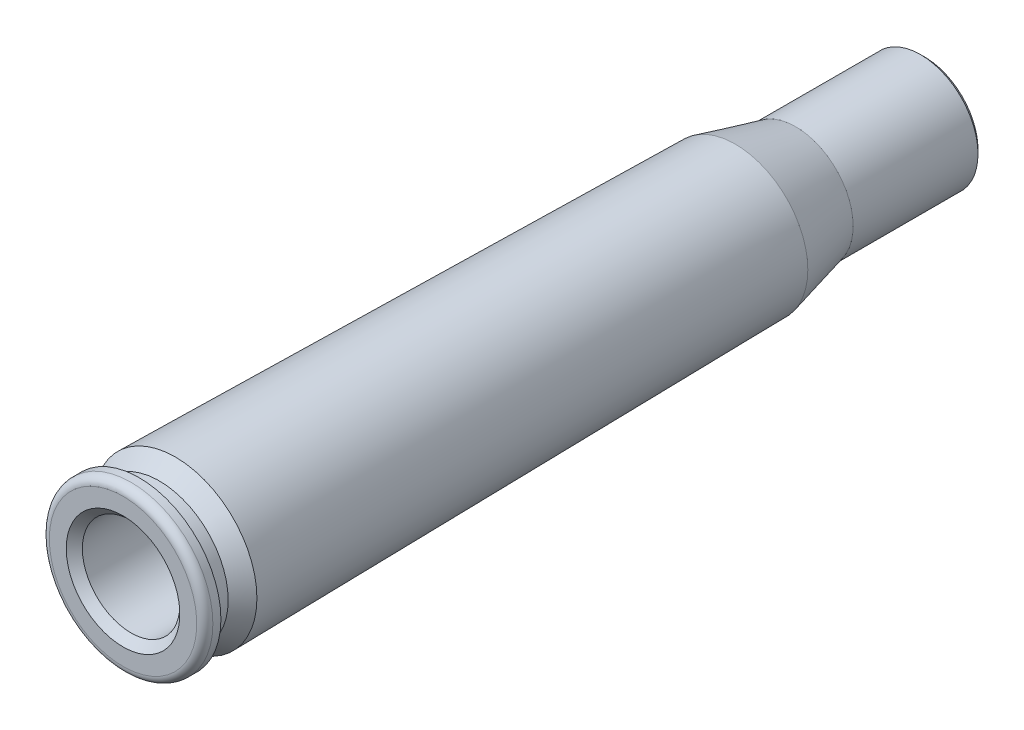
ISO-10303-21;
HEADER;
FILE_DESCRIPTION(('STEP AP214'),'2;1');
FILE_NAME('part.step','',(''),(''),'','','');
FILE_SCHEMA(('AUTOMOTIVE_DESIGN { 1 0 10303 214 1 1 1 1 }'));
ENDSEC;
DATA;
#1=APPLICATION_CONTEXT('core data for automotive mechanical design processes');
#2=APPLICATION_PROTOCOL_DEFINITION('international standard','automotive_design',2000,#1);
#3=PRODUCT_CONTEXT('',#1,'mechanical');
#4=PRODUCT('Part','Part','',(#3));
#5=PRODUCT_RELATED_PRODUCT_CATEGORY('part','',(#4));
#6=PRODUCT_DEFINITION_FORMATION('','',#4);
#7=PRODUCT_DEFINITION_CONTEXT('part definition',#1,'design');
#8=PRODUCT_DEFINITION('design','',#6,#7);
#9=PRODUCT_DEFINITION_SHAPE('','',#8);
#10=(LENGTH_UNIT() NAMED_UNIT(*) SI_UNIT(.MILLI.,.METRE.));
#11=(NAMED_UNIT(*) PLANE_ANGLE_UNIT() SI_UNIT($,.RADIAN.));
#12=(NAMED_UNIT(*) SI_UNIT($,.STERADIAN.) SOLID_ANGLE_UNIT());
#13=UNCERTAINTY_MEASURE_WITH_UNIT(LENGTH_MEASURE(1.E-05),#10,'distance_accuracy_value','');
#14=(GEOMETRIC_REPRESENTATION_CONTEXT(3) GLOBAL_UNCERTAINTY_ASSIGNED_CONTEXT((#13)) GLOBAL_UNIT_ASSIGNED_CONTEXT((#10,
#11,#12)) REPRESENTATION_CONTEXT('',''));
#15=CARTESIAN_POINT('',(0.,0.,0.));
#16=DIRECTION('',(0.,0.,1.));
#17=DIRECTION('',(1.,0.,0.));
#18=AXIS2_PLACEMENT_3D('',#15,#16,#17);
#19=CARTESIAN_POINT('',(0.,0.,0.));
#20=DIRECTION('',(0.,0.,1.));
#21=DIRECTION('',(1.,0.,0.));
#22=AXIS2_PLACEMENT_3D('',#19,#20,#21);
#23=CYLINDRICAL_SURFACE('',#22,6.05000000000001);
#24=CARTESIAN_POINT('',(0.,0.,-1.00000000000002));
#25=DIRECTION('',(0.,0.,-1.));
#26=DIRECTION('',(-1.,0.,0.));
#27=AXIS2_PLACEMENT_3D('',#24,#25,#26);
#28=CIRCLE('',#27,6.05000000000001);
#29=CARTESIAN_POINT('',(-6.05000000000001,0.,-1.00000000000002));
#30=VERTEX_POINT('',#29);
#31=EDGE_CURVE('E39',#30,#30,#28,.F.);
#32=ORIENTED_EDGE('',*,*,#31,.T.);
#33=EDGE_LOOP('',(#32));
#34=FACE_BOUND('',#33,.T.);
#35=CARTESIAN_POINT('',(0.,0.,-99.5));
#36=DIRECTION('',(0.,0.,1.));
#37=DIRECTION('',(1.,0.,0.));
#38=AXIS2_PLACEMENT_3D('',#35,#36,#37);
#39=CIRCLE('',#38,6.05);
#40=CARTESIAN_POINT('',(6.05,0.,-99.5));
#41=VERTEX_POINT('',#40);
#42=EDGE_CURVE('E76',#41,#41,#39,.T.);
#43=ORIENTED_EDGE('',*,*,#42,.F.);
#44=EDGE_LOOP('',(#43));
#45=FACE_BOUND('',#44,.T.);
#46=ADVANCED_FACE('F32',(#34,#45),#23,.F.);
#47=CARTESIAN_POINT('',(0.,0.,0.));
#48=DIRECTION('',(0.,0.,-1.));
#49=DIRECTION('',(-1.,0.,0.));
#50=AXIS2_PLACEMENT_3D('',#47,#48,#49);
#51=PLANE('',#50);
#52=CARTESIAN_POINT('',(0.,0.,0.));
#53=DIRECTION('',(0.,0.,-1.));
#54=DIRECTION('',(-1.,0.,0.));
#55=AXIS2_PLACEMENT_3D('',#52,#53,#54);
#56=CIRCLE('',#55,7.05000000000003);
#57=CARTESIAN_POINT('',(-7.05000000000003,0.,0.));
#58=VERTEX_POINT('',#57);
#59=EDGE_CURVE('E10',#58,#58,#56,.T.);
#60=ORIENTED_EDGE('',*,*,#59,.T.);
#61=EDGE_LOOP('',(#60));
#62=FACE_BOUND('',#61,.T.);
#63=CARTESIAN_POINT('',(0.,0.,0.));
#64=DIRECTION('',(0.,0.,-1.));
#65=DIRECTION('',(-1.,0.,0.));
#66=AXIS2_PLACEMENT_3D('',#63,#64,#65);
#67=CIRCLE('',#66,9.15);
#68=CARTESIAN_POINT('',(-9.15,0.,0.));
#69=VERTEX_POINT('',#68);
#70=EDGE_CURVE('E55',#69,#69,#67,.F.);
#71=ORIENTED_EDGE('',*,*,#70,.T.);
#72=EDGE_LOOP('',(#71));
#73=FACE_BOUND('',#72,.T.);
#74=ADVANCED_FACE('F83',(#62,#73),#51,.F.);
#75=CARTESIAN_POINT('',(0.,0.,0.));
#76=DIRECTION('',(0.,0.,1.));
#77=DIRECTION('',(1.,0.,0.));
#78=AXIS2_PLACEMENT_3D('',#75,#76,#77);
#79=CYLINDRICAL_SURFACE('',#78,10.15);
#80=CARTESIAN_POINT('',(0.,0.,-1.));
#81=DIRECTION('',(0.,0.,-1.));
#82=DIRECTION('',(-1.,0.,0.));
#83=AXIS2_PLACEMENT_3D('',#80,#81,#82);
#84=CIRCLE('',#83,10.15);
#85=CARTESIAN_POINT('',(-10.15,0.,-1.));
#86=VERTEX_POINT('',#85);
#87=EDGE_CURVE('E52',#86,#86,#84,.T.);
#88=ORIENTED_EDGE('',*,*,#87,.T.);
#89=EDGE_LOOP('',(#88));
#90=FACE_BOUND('',#89,.T.);
#91=CARTESIAN_POINT('',(0.,0.,-2.));
#92=DIRECTION('',(0.,0.,1.));
#93=DIRECTION('',(1.,0.,0.));
#94=AXIS2_PLACEMENT_3D('',#91,#92,#93);
#95=CIRCLE('',#94,10.15);
#96=CARTESIAN_POINT('',(10.15,0.,-2.));
#97=VERTEX_POINT('',#96);
#98=EDGE_CURVE('E61',#97,#97,#95,.T.);
#99=ORIENTED_EDGE('',*,*,#98,.T.);
#100=EDGE_LOOP('',(#99));
#101=FACE_BOUND('',#100,.T.);
#102=ADVANCED_FACE('F88',(#90,#101),#79,.T.);
#103=CARTESIAN_POINT('',(0.,0.,-2.));
#104=DIRECTION('',(0.,0.,1.));
#105=DIRECTION('',(1.,0.,0.));
#106=AXIS2_PLACEMENT_3D('',#103,#104,#105);
#107=PLANE('',#106);
#108=ORIENTED_EDGE('',*,*,#98,.F.);
#109=EDGE_LOOP('',(#108));
#110=FACE_BOUND('',#109,.T.);
#111=CARTESIAN_POINT('',(0.,0.,-2.));
#112=DIRECTION('',(0.,0.,1.));
#113=DIRECTION('',(1.,0.,0.));
#114=AXIS2_PLACEMENT_3D('',#111,#112,#113);
#115=CIRCLE('',#114,8.55);
#116=CARTESIAN_POINT('',(8.55,0.,-2.));
#117=VERTEX_POINT('',#116);
#118=EDGE_CURVE('E64',#117,#117,#115,.T.);
#119=ORIENTED_EDGE('',*,*,#118,.T.);
#120=EDGE_LOOP('',(#119));
#121=FACE_BOUND('',#120,.T.);
#122=ADVANCED_FACE('F132',(#110,#121),#107,.F.);
#123=CARTESIAN_POINT('',(0.,0.,0.));
#124=DIRECTION('',(0.,0.,1.));
#125=DIRECTION('',(1.,0.,0.));
#126=AXIS2_PLACEMENT_3D('',#123,#124,#125);
#127=CYLINDRICAL_SURFACE('',#126,8.55);
#128=ORIENTED_EDGE('',*,*,#118,.F.);
#129=EDGE_LOOP('',(#128));
#130=FACE_BOUND('',#129,.T.);
#131=CARTESIAN_POINT('',(0.,0.,-4.5));
#132=DIRECTION('',(0.,0.,1.));
#133=DIRECTION('',(1.,0.,0.));
#134=AXIS2_PLACEMENT_3D('',#131,#132,#133);
#135=CIRCLE('',#134,8.55);
#136=CARTESIAN_POINT('',(8.55,0.,-4.5));
#137=VERTEX_POINT('',#136);
#138=EDGE_CURVE('E67',#137,#137,#135,.T.);
#139=ORIENTED_EDGE('',*,*,#138,.T.);
#140=EDGE_LOOP('',(#139));
#141=FACE_BOUND('',#140,.T.);
#142=ADVANCED_FACE('F124',(#130,#141),#127,.T.);
#143=CARTESIAN_POINT('',(0.,0.,-76.));
#144=DIRECTION('',(0.,0.,1.));
#145=DIRECTION('',(1.,0.,0.));
#146=AXIS2_PLACEMENT_3D('',#143,#144,#145);
#147=CONICAL_SURFACE('',#146,9.,0.0160825293704307);
#148=CARTESIAN_POINT('',(0.,0.,-6.49974135782394));
#149=DIRECTION('',(0.,0.,-1.));
#150=DIRECTION('',(-1.,0.,0.));
#151=AXIS2_PLACEMENT_3D('',#148,#149,#150);
#152=CIRCLE('',#151,10.1178363278112);
#153=CARTESIAN_POINT('',(-10.1178363278112,0.,-6.49974135782394));
#154=VERTEX_POINT('',#153);
#155=EDGE_CURVE('E58',#154,#154,#152,.T.);
#156=ORIENTED_EDGE('',*,*,#155,.T.);
#157=EDGE_LOOP('',(#156));
#158=FACE_BOUND('',#157,.T.);
#159=CARTESIAN_POINT('',(0.,0.,-76.));
#160=DIRECTION('',(0.,0.,1.));
#161=DIRECTION('',(1.,0.,0.));
#162=AXIS2_PLACEMENT_3D('',#159,#160,#161);
#163=CIRCLE('',#162,9.);
#164=CARTESIAN_POINT('',(9.,0.,-76.));
#165=VERTEX_POINT('',#164);
#166=EDGE_CURVE('E70',#165,#165,#163,.T.);
#167=ORIENTED_EDGE('',*,*,#166,.T.);
#168=EDGE_LOOP('',(#167));
#169=FACE_BOUND('',#168,.T.);
#170=ADVANCED_FACE('F118',(#158,#169),#147,.T.);
#171=CARTESIAN_POINT('',(0.,0.,-83.5));
#172=DIRECTION('',(0.,0.,1.));
#173=DIRECTION('',(1.,0.,0.));
#174=AXIS2_PLACEMENT_3D('',#171,#172,#173);
#175=CONICAL_SURFACE('',#174,7.125,0.244978663126864);
#176=ORIENTED_EDGE('',*,*,#166,.F.);
#177=EDGE_LOOP('',(#176));
#178=FACE_BOUND('',#177,.T.);
#179=CARTESIAN_POINT('',(0.,0.,-83.5));
#180=DIRECTION('',(0.,0.,1.));
#181=DIRECTION('',(1.,0.,0.));
#182=AXIS2_PLACEMENT_3D('',#179,#180,#181);
#183=CIRCLE('',#182,7.125);
#184=CARTESIAN_POINT('',(7.125,0.,-83.5));
#185=VERTEX_POINT('',#184);
#186=EDGE_CURVE('E73',#185,#185,#183,.T.);
#187=ORIENTED_EDGE('',*,*,#186,.T.);
#188=EDGE_LOOP('',(#187));
#189=FACE_BOUND('',#188,.T.);
#190=ADVANCED_FACE('F113',(#178,#189),#175,.T.);
#191=CARTESIAN_POINT('',(0.,0.,0.));
#192=DIRECTION('',(0.,0.,1.));
#193=DIRECTION('',(1.,0.,0.));
#194=AXIS2_PLACEMENT_3D('',#191,#192,#193);
#195=CYLINDRICAL_SURFACE('',#194,7.125);
#196=CARTESIAN_POINT('',(0.,0.,-99.));
#197=DIRECTION('',(0.,0.,-1.));
#198=DIRECTION('',(-1.,0.,0.));
#199=AXIS2_PLACEMENT_3D('',#196,#197,#198);
#200=CIRCLE('',#199,7.125);
#201=CARTESIAN_POINT('',(-7.125,0.,-99.));
#202=VERTEX_POINT('',#201);
#203=EDGE_CURVE('E47',#202,#202,#200,.F.);
#204=ORIENTED_EDGE('',*,*,#203,.T.);
#205=EDGE_LOOP('',(#204));
#206=FACE_BOUND('',#205,.T.);
#207=ORIENTED_EDGE('',*,*,#186,.F.);
#208=EDGE_LOOP('',(#207));
#209=FACE_BOUND('',#208,.T.);
#210=ADVANCED_FACE('F110',(#206,#209),#195,.T.);
#211=CARTESIAN_POINT('',(0.,0.,-99.5));
#212=DIRECTION('',(0.,0.,-1.));
#213=DIRECTION('',(-1.,0.,0.));
#214=AXIS2_PLACEMENT_3D('',#211,#212,#213);
#215=PLANE('',#214);
#216=CARTESIAN_POINT('',(0.,0.,-99.5));
#217=DIRECTION('',(0.,0.,-1.));
#218=DIRECTION('',(-1.,0.,0.));
#219=AXIS2_PLACEMENT_3D('',#216,#217,#218);
#220=CIRCLE('',#219,6.62500000000002);
#221=CARTESIAN_POINT('',(-6.62500000000002,0.,-99.5));
#222=VERTEX_POINT('',#221);
#223=EDGE_CURVE('E43',#222,#222,#220,.T.);
#224=ORIENTED_EDGE('',*,*,#223,.T.);
#225=EDGE_LOOP('',(#224));
#226=FACE_BOUND('',#225,.T.);
#227=ORIENTED_EDGE('',*,*,#42,.T.);
#228=EDGE_LOOP('',(#227));
#229=FACE_BOUND('',#228,.T.);
#230=ADVANCED_FACE('F80',(#226,#229),#215,.T.);
#231=CARTESIAN_POINT('',(0.,0.,-4.5));
#232=DIRECTION('',(0.,0.,-1.));
#233=DIRECTION('',(-1.,0.,0.));
#234=AXIS2_PLACEMENT_3D('',#231,#232,#233);
#235=CONICAL_SURFACE('',#234,8.54999999999991,0.664920527717462);
#236=ORIENTED_EDGE('',*,*,#155,.F.);
#237=EDGE_LOOP('',(#236));
#238=FACE_BOUND('',#237,.T.);
#239=ORIENTED_EDGE('',*,*,#138,.F.);
#240=EDGE_LOOP('',(#239));
#241=FACE_BOUND('',#240,.T.);
#242=ADVANCED_FACE('F92',(#238,#241),#235,.T.);
#243=CARTESIAN_POINT('',(0.,0.,-1.));
#244=DIRECTION('',(0.,0.,-1.));
#245=DIRECTION('',(-1.,0.,0.));
#246=AXIS2_PLACEMENT_3D('',#243,#244,#245);
#247=TOROIDAL_SURFACE('',#246,9.15,1.);
#248=ORIENTED_EDGE('',*,*,#87,.F.);
#249=EDGE_LOOP('',(#248));
#250=FACE_BOUND('',#249,.T.);
#251=ORIENTED_EDGE('',*,*,#70,.F.);
#252=EDGE_LOOP('',(#251));
#253=FACE_BOUND('',#252,.T.);
#254=ADVANCED_FACE('F95',(#250,#253),#247,.T.);
#255=CARTESIAN_POINT('',(0.,0.,-99.));
#256=DIRECTION('',(0.,0.,1.));
#257=DIRECTION('',(1.,0.,0.));
#258=AXIS2_PLACEMENT_3D('',#255,#256,#257);
#259=CONICAL_SURFACE('',#258,7.125,0.785398163397441);
#260=ORIENTED_EDGE('',*,*,#223,.F.);
#261=EDGE_LOOP('',(#260));
#262=FACE_BOUND('',#261,.T.);
#263=ORIENTED_EDGE('',*,*,#203,.F.);
#264=EDGE_LOOP('',(#263));
#265=FACE_BOUND('',#264,.T.);
#266=ADVANCED_FACE('F98',(#262,#265),#259,.T.);
#267=CARTESIAN_POINT('',(0.,0.,-1.00000000000002));
#268=DIRECTION('',(0.,0.,1.));
#269=DIRECTION('',(1.,0.,0.));
#270=AXIS2_PLACEMENT_3D('',#267,#268,#269);
#271=CONICAL_SURFACE('',#270,6.05000000000001,0.785398163397452);
#272=ORIENTED_EDGE('',*,*,#59,.F.);
#273=EDGE_LOOP('',(#272));
#274=FACE_BOUND('',#273,.T.);
#275=ORIENTED_EDGE('',*,*,#31,.F.);
#276=EDGE_LOOP('',(#275));
#277=FACE_BOUND('',#276,.T.);
#278=ADVANCED_FACE('F34',(#274,#277),#271,.F.);
#279=CLOSED_SHELL('',(#46,#74,#102,#122,#142,#170,#190,#210,#230,#242,#254,#266,#278));
#280=MANIFOLD_SOLID_BREP('B2',#279);
#281=ADVANCED_BREP_SHAPE_REPRESENTATION('',(#18,#280),#14);
#282=SHAPE_DEFINITION_REPRESENTATION(#9,#281);
ENDSEC;
END-ISO-10303-21;
